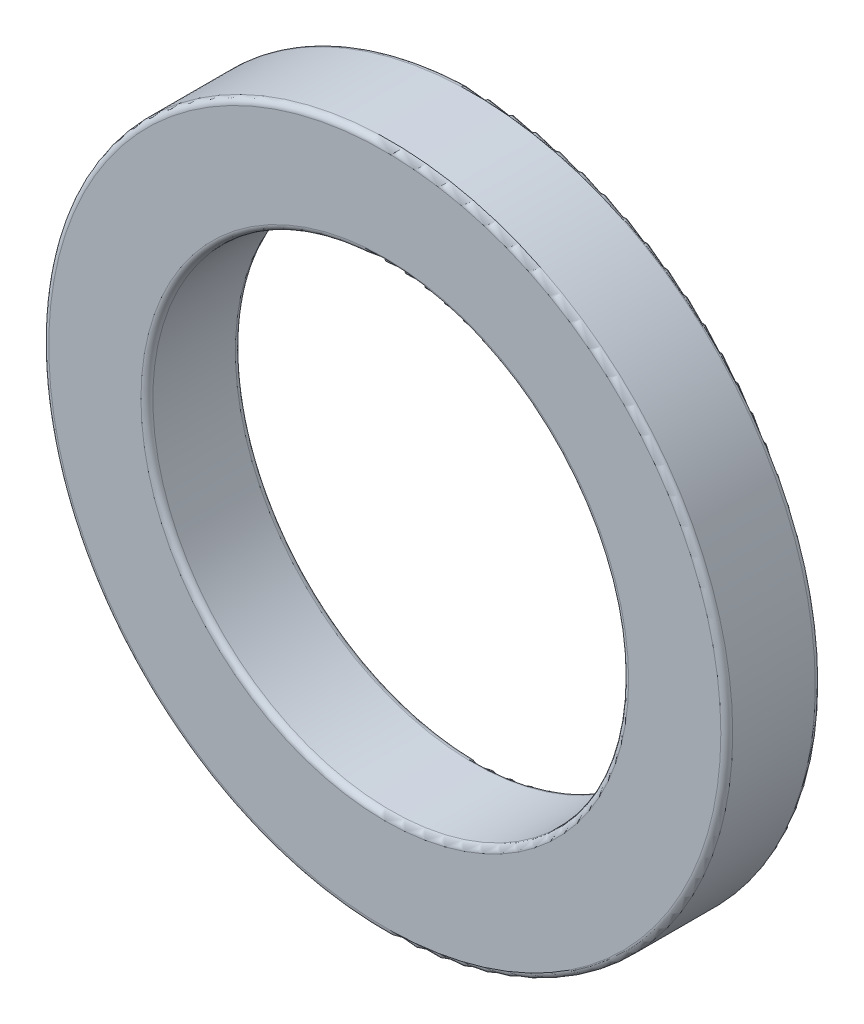
ISO-10303-21;
HEADER;
FILE_DESCRIPTION(('STEP AP214'),'2;1');
FILE_NAME('part.step','',(''),(''),'','','');
FILE_SCHEMA(('AUTOMOTIVE_DESIGN { 1 0 10303 214 1 1 1 1 }'));
ENDSEC;
DATA;
#1=APPLICATION_CONTEXT('core data for automotive mechanical design processes');
#2=APPLICATION_PROTOCOL_DEFINITION('international standard','automotive_design',2000,#1);
#3=PRODUCT_CONTEXT('',#1,'mechanical');
#4=PRODUCT('Part','Part','',(#3));
#5=PRODUCT_RELATED_PRODUCT_CATEGORY('part','',(#4));
#6=PRODUCT_DEFINITION_FORMATION('','',#4);
#7=PRODUCT_DEFINITION_CONTEXT('part definition',#1,'design');
#8=PRODUCT_DEFINITION('design','',#6,#7);
#9=PRODUCT_DEFINITION_SHAPE('','',#8);
#10=(LENGTH_UNIT() NAMED_UNIT(*) SI_UNIT(.MILLI.,.METRE.));
#11=(NAMED_UNIT(*) PLANE_ANGLE_UNIT() SI_UNIT($,.RADIAN.));
#12=(NAMED_UNIT(*) SI_UNIT($,.STERADIAN.) SOLID_ANGLE_UNIT());
#13=UNCERTAINTY_MEASURE_WITH_UNIT(LENGTH_MEASURE(1.E-05),#10,'distance_accuracy_value','');
#14=(GEOMETRIC_REPRESENTATION_CONTEXT(3) GLOBAL_UNCERTAINTY_ASSIGNED_CONTEXT((#13)) GLOBAL_UNIT_ASSIGNED_CONTEXT((#10,
#11,#12)) REPRESENTATION_CONTEXT('',''));
#15=CARTESIAN_POINT('',(0.,0.,0.));
#16=DIRECTION('',(0.,0.,1.));
#17=DIRECTION('',(1.,0.,0.));
#18=AXIS2_PLACEMENT_3D('',#15,#16,#17);
#19=CARTESIAN_POINT('',(0.,0.,0.79375));
#20=DIRECTION('',(0.,0.,1.));
#21=DIRECTION('',(1.,0.,0.));
#22=AXIS2_PLACEMENT_3D('',#19,#20,#21);
#23=PLANE('',#22);
#24=CARTESIAN_POINT('',(0.,0.,0.79375));
#25=DIRECTION('',(0.,0.,1.));
#26=DIRECTION('',(1.,0.,0.));
#27=AXIS2_PLACEMENT_3D('',#24,#25,#26);
#28=CIRCLE('',#27,5.65);
#29=CARTESIAN_POINT('',(5.65,0.,0.79375));
#30=VERTEX_POINT('',#29);
#31=EDGE_CURVE('E43',#30,#30,#28,.T.);
#32=ORIENTED_EDGE('',*,*,#31,.T.);
#33=EDGE_LOOP('',(#32));
#34=FACE_BOUND('',#33,.T.);
#35=CARTESIAN_POINT('',(0.,0.,0.79375));
#36=DIRECTION('',(0.,0.,1.));
#37=DIRECTION('',(1.,0.,0.));
#38=AXIS2_PLACEMENT_3D('',#35,#36,#37);
#39=CIRCLE('',#38,4.1);
#40=CARTESIAN_POINT('',(4.1,0.,0.79375));
#41=VERTEX_POINT('',#40);
#42=EDGE_CURVE('E47',#41,#41,#39,.F.);
#43=ORIENTED_EDGE('',*,*,#42,.T.);
#44=EDGE_LOOP('',(#43));
#45=FACE_BOUND('',#44,.T.);
#46=ADVANCED_FACE('F32',(#34,#45),#23,.T.);
#47=CARTESIAN_POINT('',(0.,0.,-0.79375));
#48=DIRECTION('',(0.,0.,1.));
#49=DIRECTION('',(1.,0.,0.));
#50=AXIS2_PLACEMENT_3D('',#47,#48,#49);
#51=PLANE('',#50);
#52=CARTESIAN_POINT('',(0.,0.,-0.79375));
#53=DIRECTION('',(0.,0.,1.));
#54=DIRECTION('',(1.,0.,0.));
#55=AXIS2_PLACEMENT_3D('',#52,#53,#54);
#56=CIRCLE('',#55,5.65);
#57=CARTESIAN_POINT('',(5.65,0.,-0.79375));
#58=VERTEX_POINT('',#57);
#59=EDGE_CURVE('E52',#58,#58,#56,.F.);
#60=ORIENTED_EDGE('',*,*,#59,.T.);
#61=EDGE_LOOP('',(#60));
#62=FACE_BOUND('',#61,.T.);
#63=CARTESIAN_POINT('',(0.,0.,-0.79375));
#64=DIRECTION('',(0.,0.,1.));
#65=DIRECTION('',(1.,0.,0.));
#66=AXIS2_PLACEMENT_3D('',#63,#64,#65);
#67=CIRCLE('',#66,4.1);
#68=CARTESIAN_POINT('',(4.1,0.,-0.79375));
#69=VERTEX_POINT('',#68);
#70=EDGE_CURVE('E55',#69,#69,#67,.T.);
#71=ORIENTED_EDGE('',*,*,#70,.T.);
#72=EDGE_LOOP('',(#71));
#73=FACE_BOUND('',#72,.T.);
#74=ADVANCED_FACE('F77',(#62,#73),#51,.F.);
#75=CARTESIAN_POINT('',(0.,0.,0.79375));
#76=DIRECTION('',(0.,0.,-1.));
#77=DIRECTION('',(-1.,0.,0.));
#78=AXIS2_PLACEMENT_3D('',#75,#76,#77);
#79=CYLINDRICAL_SURFACE('',#78,5.75);
#80=CARTESIAN_POINT('',(0.,0.,-0.69375));
#81=DIRECTION('',(0.,0.,1.));
#82=DIRECTION('',(1.,0.,0.));
#83=AXIS2_PLACEMENT_3D('',#80,#81,#82);
#84=CIRCLE('',#83,5.75);
#85=CARTESIAN_POINT('',(5.75,0.,-0.69375));
#86=VERTEX_POINT('',#85);
#87=EDGE_CURVE('E58',#86,#86,#84,.T.);
#88=ORIENTED_EDGE('',*,*,#87,.T.);
#89=EDGE_LOOP('',(#88));
#90=FACE_BOUND('',#89,.T.);
#91=CARTESIAN_POINT('',(0.,0.,0.69375));
#92=DIRECTION('',(0.,0.,1.));
#93=DIRECTION('',(1.,0.,0.));
#94=AXIS2_PLACEMENT_3D('',#91,#92,#93);
#95=CIRCLE('',#94,5.75);
#96=CARTESIAN_POINT('',(5.75,0.,0.69375));
#97=VERTEX_POINT('',#96);
#98=EDGE_CURVE('E61',#97,#97,#95,.F.);
#99=ORIENTED_EDGE('',*,*,#98,.T.);
#100=EDGE_LOOP('',(#99));
#101=FACE_BOUND('',#100,.T.);
#102=ADVANCED_FACE('F65',(#90,#101),#79,.T.);
#103=CARTESIAN_POINT('',(0.,0.,0.79375));
#104=DIRECTION('',(0.,0.,-1.));
#105=DIRECTION('',(-1.,0.,0.));
#106=AXIS2_PLACEMENT_3D('',#103,#104,#105);
#107=CYLINDRICAL_SURFACE('',#106,4.);
#108=CARTESIAN_POINT('',(0.,0.,-0.69375));
#109=DIRECTION('',(0.,0.,1.));
#110=DIRECTION('',(1.,0.,0.));
#111=AXIS2_PLACEMENT_3D('',#108,#109,#110);
#112=CIRCLE('',#111,4.);
#113=CARTESIAN_POINT('',(4.,0.,-0.69375));
#114=VERTEX_POINT('',#113);
#115=EDGE_CURVE('E10',#114,#114,#112,.F.);
#116=ORIENTED_EDGE('',*,*,#115,.T.);
#117=EDGE_LOOP('',(#116));
#118=FACE_BOUND('',#117,.T.);
#119=CARTESIAN_POINT('',(0.,0.,0.69375));
#120=DIRECTION('',(0.,0.,1.));
#121=DIRECTION('',(1.,0.,0.));
#122=AXIS2_PLACEMENT_3D('',#119,#120,#121);
#123=CIRCLE('',#122,4.);
#124=CARTESIAN_POINT('',(4.,0.,0.69375));
#125=VERTEX_POINT('',#124);
#126=EDGE_CURVE('E39',#125,#125,#123,.T.);
#127=ORIENTED_EDGE('',*,*,#126,.T.);
#128=EDGE_LOOP('',(#127));
#129=FACE_BOUND('',#128,.T.);
#130=ADVANCED_FACE('F93',(#118,#129),#107,.F.);
#131=CARTESIAN_POINT('',(0.,0.,-0.69375));
#132=DIRECTION('',(0.,0.,1.));
#133=DIRECTION('',(1.,0.,0.));
#134=AXIS2_PLACEMENT_3D('',#131,#132,#133);
#135=TOROIDAL_SURFACE('',#134,5.65,0.1);
#136=ORIENTED_EDGE('',*,*,#59,.F.);
#137=EDGE_LOOP('',(#136));
#138=FACE_BOUND('',#137,.T.);
#139=ORIENTED_EDGE('',*,*,#87,.F.);
#140=EDGE_LOOP('',(#139));
#141=FACE_BOUND('',#140,.T.);
#142=ADVANCED_FACE('F71',(#138,#141),#135,.T.);
#143=CARTESIAN_POINT('',(0.,0.,0.69375));
#144=DIRECTION('',(0.,0.,1.));
#145=DIRECTION('',(1.,0.,0.));
#146=AXIS2_PLACEMENT_3D('',#143,#144,#145);
#147=TOROIDAL_SURFACE('',#146,5.65,0.1);
#148=ORIENTED_EDGE('',*,*,#98,.F.);
#149=EDGE_LOOP('',(#148));
#150=FACE_BOUND('',#149,.T.);
#151=ORIENTED_EDGE('',*,*,#31,.F.);
#152=EDGE_LOOP('',(#151));
#153=FACE_BOUND('',#152,.T.);
#154=ADVANCED_FACE('F67',(#150,#153),#147,.T.);
#155=CARTESIAN_POINT('',(0.,0.,-0.69375));
#156=DIRECTION('',(0.,0.,1.));
#157=DIRECTION('',(1.,0.,0.));
#158=AXIS2_PLACEMENT_3D('',#155,#156,#157);
#159=TOROIDAL_SURFACE('',#158,4.1,0.1);
#160=ORIENTED_EDGE('',*,*,#115,.F.);
#161=EDGE_LOOP('',(#160));
#162=FACE_BOUND('',#161,.T.);
#163=ORIENTED_EDGE('',*,*,#70,.F.);
#164=EDGE_LOOP('',(#163));
#165=FACE_BOUND('',#164,.T.);
#166=ADVANCED_FACE('F70',(#162,#165),#159,.T.);
#167=CARTESIAN_POINT('',(0.,0.,0.69375));
#168=DIRECTION('',(0.,0.,1.));
#169=DIRECTION('',(1.,0.,0.));
#170=AXIS2_PLACEMENT_3D('',#167,#168,#169);
#171=TOROIDAL_SURFACE('',#170,4.1,0.1);
#172=ORIENTED_EDGE('',*,*,#42,.F.);
#173=EDGE_LOOP('',(#172));
#174=FACE_BOUND('',#173,.T.);
#175=ORIENTED_EDGE('',*,*,#126,.F.);
#176=EDGE_LOOP('',(#175));
#177=FACE_BOUND('',#176,.T.);
#178=ADVANCED_FACE('F34',(#174,#177),#171,.T.);
#179=CLOSED_SHELL('',(#46,#74,#102,#130,#142,#154,#166,#178));
#180=MANIFOLD_SOLID_BREP('B2',#179);
#181=ADVANCED_BREP_SHAPE_REPRESENTATION('',(#18,#180),#14);
#182=SHAPE_DEFINITION_REPRESENTATION(#9,#181);
ENDSEC;
END-ISO-10303-21;
